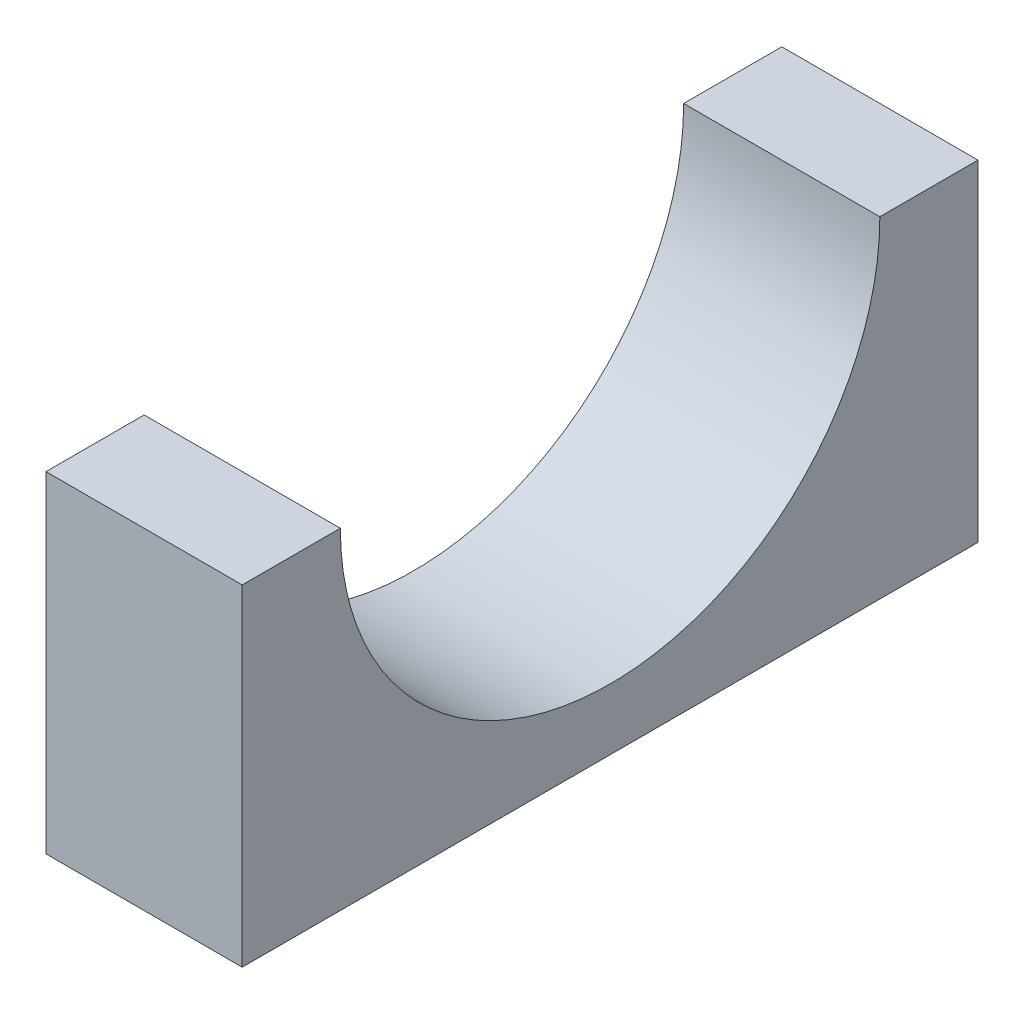
ISO-10303-21;
HEADER;
FILE_DESCRIPTION(('STEP AP214'),'2;1');
FILE_NAME('part.step','',(''),(''),'','','');
FILE_SCHEMA(('AUTOMOTIVE_DESIGN { 1 0 10303 214 1 1 1 1 }'));
ENDSEC;
DATA;
#1=APPLICATION_CONTEXT('core data for automotive mechanical design processes');
#2=APPLICATION_PROTOCOL_DEFINITION('international standard','automotive_design',2000,#1);
#3=PRODUCT_CONTEXT('',#1,'mechanical');
#4=PRODUCT('Part','Part','',(#3));
#5=PRODUCT_RELATED_PRODUCT_CATEGORY('part','',(#4));
#6=PRODUCT_DEFINITION_FORMATION('','',#4);
#7=PRODUCT_DEFINITION_CONTEXT('part definition',#1,'design');
#8=PRODUCT_DEFINITION('design','',#6,#7);
#9=PRODUCT_DEFINITION_SHAPE('','',#8);
#10=(LENGTH_UNIT() NAMED_UNIT(*) SI_UNIT(.MILLI.,.METRE.));
#11=(NAMED_UNIT(*) PLANE_ANGLE_UNIT() SI_UNIT($,.RADIAN.));
#12=(NAMED_UNIT(*) SI_UNIT($,.STERADIAN.) SOLID_ANGLE_UNIT());
#13=UNCERTAINTY_MEASURE_WITH_UNIT(LENGTH_MEASURE(1.E-05),#10,'distance_accuracy_value','');
#14=(GEOMETRIC_REPRESENTATION_CONTEXT(3) GLOBAL_UNCERTAINTY_ASSIGNED_CONTEXT((#13)) GLOBAL_UNIT_ASSIGNED_CONTEXT((#10,
#11,#12)) REPRESENTATION_CONTEXT('',''));
#15=CARTESIAN_POINT('',(0.,0.,0.));
#16=DIRECTION('',(0.,0.,1.));
#17=DIRECTION('',(1.,0.,0.));
#18=AXIS2_PLACEMENT_3D('',#15,#16,#17);
#19=CARTESIAN_POINT('',(8.,0.,11.0020147484004));
#20=DIRECTION('',(0.,-1.,0.));
#21=DIRECTION('',(0.,0.,-1.));
#22=AXIS2_PLACEMENT_3D('',#19,#20,#21);
#23=PLANE('',#22);
#24=DIRECTION('',(0.,0.,1.));
#25=VECTOR('',#24,1.);
#26=CARTESIAN_POINT('',(0.,0.,11.0020147484004));
#27=LINE('',#26,#25);
#28=CARTESIAN_POINT('',(0.,0.,11.));
#29=VERTEX_POINT('',#28);
#30=CARTESIAN_POINT('',(0.,0.,15.0020147484004));
#31=VERTEX_POINT('',#30);
#32=EDGE_CURVE('E86',#29,#31,#27,.T.);
#33=ORIENTED_EDGE('',*,*,#32,.T.);
#34=DIRECTION('',(-1.,0.,0.));
#35=VECTOR('',#34,1.);
#36=CARTESIAN_POINT('',(8.,0.,15.0020147484004));
#37=LINE('',#36,#35);
#38=CARTESIAN_POINT('',(8.,0.,15.0020147484004));
#39=VERTEX_POINT('',#38);
#40=EDGE_CURVE('E11',#39,#31,#37,.T.);
#41=ORIENTED_EDGE('',*,*,#40,.F.);
#42=DIRECTION('',(0.,0.,1.));
#43=VECTOR('',#42,1.);
#44=CARTESIAN_POINT('',(8.,0.,11.0020147484004));
#45=LINE('',#44,#43);
#46=CARTESIAN_POINT('',(8.,0.,11.));
#47=VERTEX_POINT('',#46);
#48=EDGE_CURVE('E92',#47,#39,#45,.T.);
#49=ORIENTED_EDGE('',*,*,#48,.F.);
#50=DIRECTION('',(-1.,0.,0.));
#51=VECTOR('',#50,1.);
#52=CARTESIAN_POINT('',(8.,0.,11.));
#53=LINE('',#52,#51);
#54=EDGE_CURVE('E127',#47,#29,#53,.T.);
#55=ORIENTED_EDGE('',*,*,#54,.T.);
#56=EDGE_LOOP('',(#33,#41,#49,#55));
#57=FACE_BOUND('',#56,.T.);
#58=ADVANCED_FACE('F40',(#57),#23,.F.);
#59=CARTESIAN_POINT('',(8.,0.,15.0020147484004));
#60=DIRECTION('',(0.,0.,-1.));
#61=DIRECTION('',(0.,1.,0.));
#62=AXIS2_PLACEMENT_3D('',#59,#60,#61);
#63=PLANE('',#62);
#64=DIRECTION('',(0.,-1.,0.));
#65=VECTOR('',#64,1.);
#66=CARTESIAN_POINT('',(0.,0.,15.0020147484004));
#67=LINE('',#66,#65);
#68=CARTESIAN_POINT('',(0.,-13.5,15.0020147484004));
#69=VERTEX_POINT('',#68);
#70=EDGE_CURVE('E133',#31,#69,#67,.T.);
#71=ORIENTED_EDGE('',*,*,#70,.T.);
#72=DIRECTION('',(-1.,0.,0.));
#73=VECTOR('',#72,1.);
#74=CARTESIAN_POINT('',(8.,-13.5,15.0020147484004));
#75=LINE('',#74,#73);
#76=CARTESIAN_POINT('',(8.,-13.5,15.0020147484004));
#77=VERTEX_POINT('',#76);
#78=EDGE_CURVE('E49',#77,#69,#75,.T.);
#79=ORIENTED_EDGE('',*,*,#78,.F.);
#80=DIRECTION('',(0.,-1.,0.));
#81=VECTOR('',#80,1.);
#82=CARTESIAN_POINT('',(8.,0.,15.0020147484004));
#83=LINE('',#82,#81);
#84=EDGE_CURVE('E165',#39,#77,#83,.T.);
#85=ORIENTED_EDGE('',*,*,#84,.F.);
#86=ORIENTED_EDGE('',*,*,#40,.T.);
#87=EDGE_LOOP('',(#71,#79,#85,#86));
#88=FACE_BOUND('',#87,.T.);
#89=ADVANCED_FACE('F198',(#88),#63,.F.);
#90=CARTESIAN_POINT('',(8.,-13.5,15.0020147484004));
#91=DIRECTION('',(0.,1.,0.));
#92=DIRECTION('',(0.,0.,1.));
#93=AXIS2_PLACEMENT_3D('',#90,#91,#92);
#94=PLANE('',#93);
#95=CARTESIAN_POINT('',(4.,-13.5,12.5020147484004));
#96=DIRECTION('',(0.,-1.,0.));
#97=DIRECTION('',(0.,0.,-1.));
#98=AXIS2_PLACEMENT_3D('',#95,#96,#97);
#99=CIRCLE('',#98,1.24999999999999);
#100=CARTESIAN_POINT('',(4.,-13.5,11.2520147484004));
#101=VERTEX_POINT('',#100);
#102=EDGE_CURVE('E176',#101,#101,#99,.T.);
#103=ORIENTED_EDGE('',*,*,#102,.F.);
#104=EDGE_LOOP('',(#103));
#105=FACE_BOUND('',#104,.T.);
#106=CARTESIAN_POINT('',(4.,-13.5,-12.5017779111191));
#107=DIRECTION('',(0.,-1.,0.));
#108=DIRECTION('',(0.,0.,-1.));
#109=AXIS2_PLACEMENT_3D('',#106,#107,#108);
#110=CIRCLE('',#109,1.24999999999999);
#111=CARTESIAN_POINT('',(4.,-13.5,-13.7517779111191));
#112=VERTEX_POINT('',#111);
#113=EDGE_CURVE('E172',#112,#112,#110,.T.);
#114=ORIENTED_EDGE('',*,*,#113,.F.);
#115=EDGE_LOOP('',(#114));
#116=FACE_BOUND('',#115,.T.);
#117=DIRECTION('',(0.,0.,-1.));
#118=VECTOR('',#117,1.);
#119=CARTESIAN_POINT('',(0.,-13.5,15.0020147484004));
#120=LINE('',#119,#118);
#121=CARTESIAN_POINT('',(0.,-13.5,-15.0017779111191));
#122=VERTEX_POINT('',#121);
#123=EDGE_CURVE('E137',#69,#122,#120,.T.);
#124=ORIENTED_EDGE('',*,*,#123,.T.);
#125=DIRECTION('',(-1.,0.,0.));
#126=VECTOR('',#125,1.);
#127=CARTESIAN_POINT('',(8.,-13.5,-15.0017779111191));
#128=LINE('',#127,#126);
#129=CARTESIAN_POINT('',(8.,-13.5,-15.0017779111191));
#130=VERTEX_POINT('',#129);
#131=EDGE_CURVE('E118',#130,#122,#128,.T.);
#132=ORIENTED_EDGE('',*,*,#131,.F.);
#133=DIRECTION('',(0.,0.,-1.));
#134=VECTOR('',#133,1.);
#135=CARTESIAN_POINT('',(8.,-13.5,15.0020147484004));
#136=LINE('',#135,#134);
#137=EDGE_CURVE('E106',#77,#130,#136,.T.);
#138=ORIENTED_EDGE('',*,*,#137,.F.);
#139=ORIENTED_EDGE('',*,*,#78,.T.);
#140=EDGE_LOOP('',(#124,#132,#138,#139));
#141=FACE_BOUND('',#140,.T.);
#142=ADVANCED_FACE('F157',(#105,#116,#141),#94,.F.);
#143=CARTESIAN_POINT('',(8.,-13.5,-15.0017779111191));
#144=DIRECTION('',(0.,0.,1.));
#145=DIRECTION('',(1.,0.,0.));
#146=AXIS2_PLACEMENT_3D('',#143,#144,#145);
#147=PLANE('',#146);
#148=DIRECTION('',(0.,1.,0.));
#149=VECTOR('',#148,1.);
#150=CARTESIAN_POINT('',(0.,-13.5,-15.0017779111191));
#151=LINE('',#150,#149);
#152=CARTESIAN_POINT('',(0.,0.,-15.0017779111191));
#153=VERTEX_POINT('',#152);
#154=EDGE_CURVE('E116',#122,#153,#151,.T.);
#155=ORIENTED_EDGE('',*,*,#154,.T.);
#156=DIRECTION('',(-1.,0.,0.));
#157=VECTOR('',#156,1.);
#158=CARTESIAN_POINT('',(8.,0.,-15.0017779111191));
#159=LINE('',#158,#157);
#160=CARTESIAN_POINT('',(8.,0.,-15.0017779111191));
#161=VERTEX_POINT('',#160);
#162=EDGE_CURVE('E113',#161,#153,#159,.T.);
#163=ORIENTED_EDGE('',*,*,#162,.F.);
#164=DIRECTION('',(0.,1.,0.));
#165=VECTOR('',#164,1.);
#166=CARTESIAN_POINT('',(8.,-13.5,-15.0017779111191));
#167=LINE('',#166,#165);
#168=EDGE_CURVE('E100',#130,#161,#167,.T.);
#169=ORIENTED_EDGE('',*,*,#168,.F.);
#170=ORIENTED_EDGE('',*,*,#131,.T.);
#171=EDGE_LOOP('',(#155,#163,#169,#170));
#172=FACE_BOUND('',#171,.T.);
#173=ADVANCED_FACE('F114',(#172),#147,.F.);
#174=CARTESIAN_POINT('',(8.,0.,-11.0017779111191));
#175=DIRECTION('',(0.,-1.,0.));
#176=DIRECTION('',(0.,0.,-1.));
#177=AXIS2_PLACEMENT_3D('',#174,#175,#176);
#178=PLANE('',#177);
#179=DIRECTION('',(0.,0.,1.));
#180=VECTOR('',#179,1.);
#181=CARTESIAN_POINT('',(0.,0.,-11.0017779111191));
#182=LINE('',#181,#180);
#183=CARTESIAN_POINT('',(0.,0.,-11.));
#184=VERTEX_POINT('',#183);
#185=EDGE_CURVE('E79',#153,#184,#182,.T.);
#186=ORIENTED_EDGE('',*,*,#185,.T.);
#187=DIRECTION('',(-1.,0.,0.));
#188=VECTOR('',#187,1.);
#189=CARTESIAN_POINT('',(8.,0.,-11.));
#190=LINE('',#189,#188);
#191=CARTESIAN_POINT('',(8.,0.,-11.));
#192=VERTEX_POINT('',#191);
#193=EDGE_CURVE('E119',#192,#184,#190,.T.);
#194=ORIENTED_EDGE('',*,*,#193,.F.);
#195=DIRECTION('',(0.,0.,1.));
#196=VECTOR('',#195,1.);
#197=CARTESIAN_POINT('',(8.,0.,-15.0017779111191));
#198=LINE('',#197,#196);
#199=EDGE_CURVE('E104',#161,#192,#198,.T.);
#200=ORIENTED_EDGE('',*,*,#199,.F.);
#201=ORIENTED_EDGE('',*,*,#162,.T.);
#202=EDGE_LOOP('',(#186,#194,#200,#201));
#203=FACE_BOUND('',#202,.T.);
#204=ADVANCED_FACE('F121',(#203),#178,.F.);
#205=CARTESIAN_POINT('',(8.,0.,0.));
#206=DIRECTION('',(-1.,0.,0.));
#207=DIRECTION('',(0.,0.,1.));
#208=AXIS2_PLACEMENT_3D('',#205,#206,#207);
#209=CYLINDRICAL_SURFACE('',#208,11.);
#210=CARTESIAN_POINT('',(0.,0.,0.));
#211=DIRECTION('',(-1.,0.,0.));
#212=DIRECTION('',(0.,0.,-1.));
#213=AXIS2_PLACEMENT_3D('',#210,#211,#212);
#214=CIRCLE('',#213,11.);
#215=EDGE_CURVE('E144',#184,#29,#214,.T.);
#216=ORIENTED_EDGE('',*,*,#215,.T.);
#217=ORIENTED_EDGE('',*,*,#54,.F.);
#218=CARTESIAN_POINT('',(8.,0.,0.));
#219=DIRECTION('',(-1.,0.,0.));
#220=DIRECTION('',(0.,0.,-1.));
#221=AXIS2_PLACEMENT_3D('',#218,#219,#220);
#222=CIRCLE('',#221,11.);
#223=EDGE_CURVE('E57',#192,#47,#222,.T.);
#224=ORIENTED_EDGE('',*,*,#223,.F.);
#225=ORIENTED_EDGE('',*,*,#193,.T.);
#226=EDGE_LOOP('',(#216,#217,#224,#225));
#227=FACE_BOUND('',#226,.T.);
#228=ADVANCED_FACE('F162',(#227),#209,.F.);
#229=CARTESIAN_POINT('',(8.,0.,0.));
#230=DIRECTION('',(1.,0.,0.));
#231=DIRECTION('',(0.,0.,-1.));
#232=AXIS2_PLACEMENT_3D('',#229,#230,#231);
#233=PLANE('',#232);
#234=ORIENTED_EDGE('',*,*,#48,.T.);
#235=ORIENTED_EDGE('',*,*,#84,.T.);
#236=ORIENTED_EDGE('',*,*,#137,.T.);
#237=ORIENTED_EDGE('',*,*,#168,.T.);
#238=ORIENTED_EDGE('',*,*,#199,.T.);
#239=ORIENTED_EDGE('',*,*,#223,.T.);
#240=EDGE_LOOP('',(#234,#235,#236,#237,#238,#239));
#241=FACE_BOUND('',#240,.T.);
#242=ADVANCED_FACE('F102',(#241),#233,.T.);
#243=CARTESIAN_POINT('',(0.,0.,0.));
#244=DIRECTION('',(1.,0.,0.));
#245=DIRECTION('',(0.,0.,-1.));
#246=AXIS2_PLACEMENT_3D('',#243,#244,#245);
#247=PLANE('',#246);
#248=ORIENTED_EDGE('',*,*,#32,.F.);
#249=ORIENTED_EDGE('',*,*,#215,.F.);
#250=ORIENTED_EDGE('',*,*,#185,.F.);
#251=ORIENTED_EDGE('',*,*,#154,.F.);
#252=ORIENTED_EDGE('',*,*,#123,.F.);
#253=ORIENTED_EDGE('',*,*,#70,.F.);
#254=EDGE_LOOP('',(#248,#249,#250,#251,#252,#253));
#255=FACE_BOUND('',#254,.T.);
#256=ADVANCED_FACE('F160',(#255),#247,.F.);
#257=CARTESIAN_POINT('',(4.,-7.,-12.5017779111191));
#258=DIRECTION('',(0.,1.,0.));
#259=DIRECTION('',(0.,0.,1.));
#260=AXIS2_PLACEMENT_3D('',#257,#258,#259);
#261=PLANE('',#260);
#262=CARTESIAN_POINT('',(4.,-7.,-12.5017779111191));
#263=DIRECTION('',(0.,-1.,0.));
#264=DIRECTION('',(0.,0.,-1.));
#265=AXIS2_PLACEMENT_3D('',#262,#263,#264);
#266=CIRCLE('',#265,1.25);
#267=CARTESIAN_POINT('',(4.,-7.,-13.7517779111191));
#268=VERTEX_POINT('',#267);
#269=EDGE_CURVE('E134',#268,#268,#266,.T.);
#270=ORIENTED_EDGE('',*,*,#269,.T.);
#271=EDGE_LOOP('',(#270));
#272=FACE_BOUND('',#271,.T.);
#273=ADVANCED_FACE('F216',(#272),#261,.F.);
#274=CARTESIAN_POINT('',(4.,-13.5,-12.5017779111191));
#275=DIRECTION('',(0.,-1.,0.));
#276=DIRECTION('',(0.,0.,-1.));
#277=AXIS2_PLACEMENT_3D('',#274,#275,#276);
#278=CYLINDRICAL_SURFACE('',#277,1.24999999999999);
#279=ORIENTED_EDGE('',*,*,#269,.F.);
#280=EDGE_LOOP('',(#279));
#281=FACE_BOUND('',#280,.T.);
#282=ORIENTED_EDGE('',*,*,#113,.T.);
#283=EDGE_LOOP('',(#282));
#284=FACE_BOUND('',#283,.T.);
#285=ADVANCED_FACE('F195',(#281,#284),#278,.F.);
#286=CARTESIAN_POINT('',(4.,-7.,12.5020147484004));
#287=DIRECTION('',(0.,1.,0.));
#288=DIRECTION('',(0.,0.,1.));
#289=AXIS2_PLACEMENT_3D('',#286,#287,#288);
#290=PLANE('',#289);
#291=CARTESIAN_POINT('',(4.,-7.,12.5020147484004));
#292=DIRECTION('',(0.,-1.,0.));
#293=DIRECTION('',(0.,0.,-1.));
#294=AXIS2_PLACEMENT_3D('',#291,#292,#293);
#295=CIRCLE('',#294,1.25);
#296=CARTESIAN_POINT('',(4.,-7.,11.2520147484004));
#297=VERTEX_POINT('',#296);
#298=EDGE_CURVE('E175',#297,#297,#295,.T.);
#299=ORIENTED_EDGE('',*,*,#298,.T.);
#300=EDGE_LOOP('',(#299));
#301=FACE_BOUND('',#300,.T.);
#302=ADVANCED_FACE('F187',(#301),#290,.F.);
#303=CARTESIAN_POINT('',(4.,-13.5,12.5020147484004));
#304=DIRECTION('',(0.,-1.,0.));
#305=DIRECTION('',(0.,0.,-1.));
#306=AXIS2_PLACEMENT_3D('',#303,#304,#305);
#307=CYLINDRICAL_SURFACE('',#306,1.24999999999999);
#308=ORIENTED_EDGE('',*,*,#298,.F.);
#309=EDGE_LOOP('',(#308));
#310=FACE_BOUND('',#309,.T.);
#311=ORIENTED_EDGE('',*,*,#102,.T.);
#312=EDGE_LOOP('',(#311));
#313=FACE_BOUND('',#312,.T.);
#314=ADVANCED_FACE('F189',(#310,#313),#307,.F.);
#315=CLOSED_SHELL('',(#58,#89,#142,#173,#204,#228,#242,#256,#273,#285,#302,#314));
#316=MANIFOLD_SOLID_BREP('B2',#315);
#317=ADVANCED_BREP_SHAPE_REPRESENTATION('',(#18,#316),#14);
#318=SHAPE_DEFINITION_REPRESENTATION(#9,#317);
ENDSEC;
END-ISO-10303-21;
